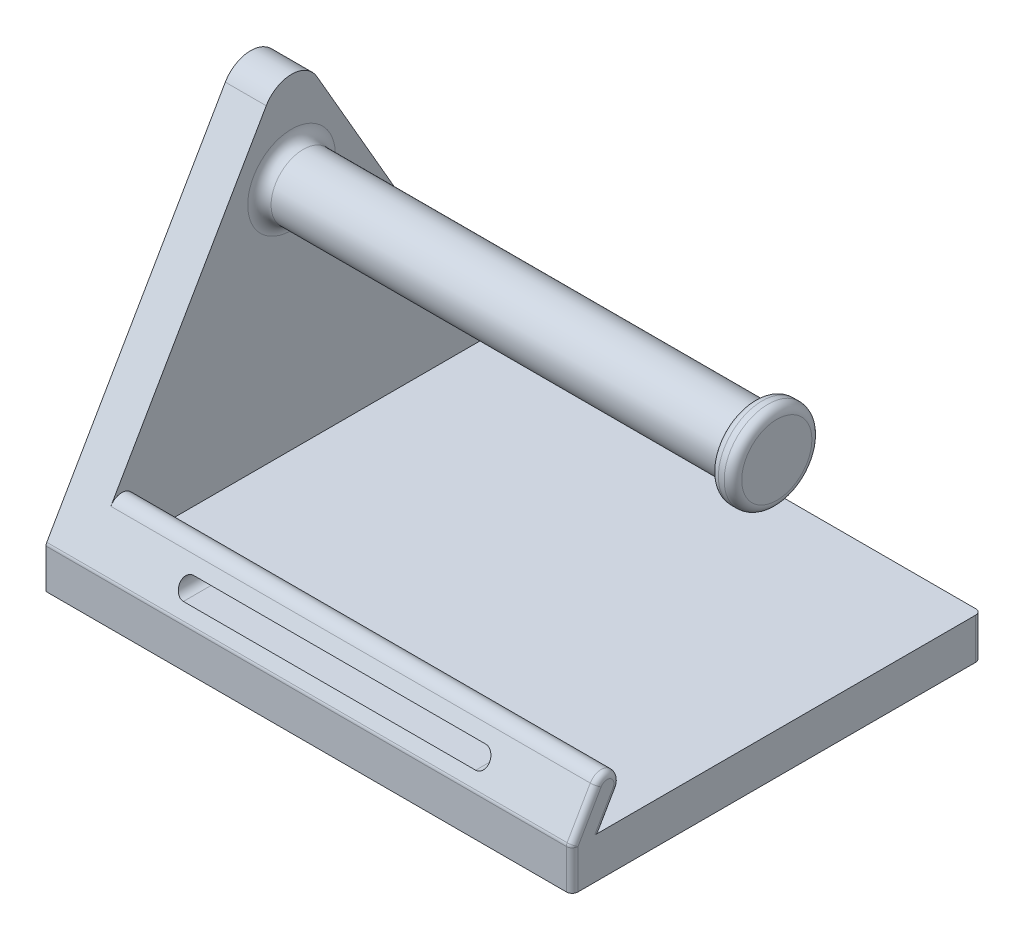
ISO-10303-21;
HEADER;
FILE_DESCRIPTION(('STEP AP214'),'2;1');
FILE_NAME('part.step','',(''),(''),'','','');
FILE_SCHEMA(('AUTOMOTIVE_DESIGN { 1 0 10303 214 1 1 1 1 }'));
ENDSEC;
DATA;
#1=APPLICATION_CONTEXT('core data for automotive mechanical design processes');
#2=APPLICATION_PROTOCOL_DEFINITION('international standard','automotive_design',2000,#1);
#3=PRODUCT_CONTEXT('',#1,'mechanical');
#4=PRODUCT('Part','Part','',(#3));
#5=PRODUCT_RELATED_PRODUCT_CATEGORY('part','',(#4));
#6=PRODUCT_DEFINITION_FORMATION('','',#4);
#7=PRODUCT_DEFINITION_CONTEXT('part definition',#1,'design');
#8=PRODUCT_DEFINITION('design','',#6,#7);
#9=PRODUCT_DEFINITION_SHAPE('','',#8);
#10=(LENGTH_UNIT() NAMED_UNIT(*) SI_UNIT(.MILLI.,.METRE.));
#11=(NAMED_UNIT(*) PLANE_ANGLE_UNIT() SI_UNIT($,.RADIAN.));
#12=(NAMED_UNIT(*) SI_UNIT($,.STERADIAN.) SOLID_ANGLE_UNIT());
#13=UNCERTAINTY_MEASURE_WITH_UNIT(LENGTH_MEASURE(1.E-05),#10,'distance_accuracy_value','');
#14=(GEOMETRIC_REPRESENTATION_CONTEXT(3) GLOBAL_UNCERTAINTY_ASSIGNED_CONTEXT((#13)) GLOBAL_UNIT_ASSIGNED_CONTEXT((#10,
#11,#12)) REPRESENTATION_CONTEXT('',''));
#15=CARTESIAN_POINT('',(0.,0.,0.));
#16=DIRECTION('',(0.,0.,1.));
#17=DIRECTION('',(1.,0.,0.));
#18=AXIS2_PLACEMENT_3D('',#15,#16,#17);
#19=CARTESIAN_POINT('',(87.5,40.,-35.));
#20=DIRECTION('',(1.,0.,0.));
#21=DIRECTION('',(0.,0.,-1.));
#22=AXIS2_PLACEMENT_3D('',#19,#20,#21);
#23=TOROIDAL_SURFACE('',#22,6.,1.5);
#24=CARTESIAN_POINT('',(86.,40.,-35.));
#25=DIRECTION('',(1.,0.,0.));
#26=DIRECTION('',(0.,0.,-1.));
#27=AXIS2_PLACEMENT_3D('',#24,#25,#26);
#28=CIRCLE('',#27,6.);
#29=CARTESIAN_POINT('',(86.,40.,-41.));
#30=VERTEX_POINT('',#29);
#31=EDGE_CURVE('E275',#30,#30,#28,.F.);
#32=ORIENTED_EDGE('',*,*,#31,.F.);
#33=EDGE_LOOP('',(#32));
#34=FACE_BOUND('',#33,.T.);
#35=CARTESIAN_POINT('',(87.5,40.,-35.));
#36=DIRECTION('',(1.,0.,0.));
#37=DIRECTION('',(0.,0.,-1.));
#38=AXIS2_PLACEMENT_3D('',#35,#36,#37);
#39=CIRCLE('',#38,7.5);
#40=CARTESIAN_POINT('',(87.5,40.,-42.5));
#41=VERTEX_POINT('',#40);
#42=EDGE_CURVE('E278',#41,#41,#39,.T.);
#43=ORIENTED_EDGE('',*,*,#42,.F.);
#44=EDGE_LOOP('',(#43));
#45=FACE_BOUND('',#44,.T.);
#46=ADVANCED_FACE('F69',(#34,#45),#23,.T.);
#47=CARTESIAN_POINT('',(88.5,40.,-35.));
#48=DIRECTION('',(1.,0.,0.));
#49=DIRECTION('',(0.,0.,-1.));
#50=AXIS2_PLACEMENT_3D('',#47,#48,#49);
#51=TOROIDAL_SURFACE('',#50,6.,1.5);
#52=CARTESIAN_POINT('',(88.5,40.,-35.));
#53=DIRECTION('',(1.,0.,0.));
#54=DIRECTION('',(0.,0.,-1.));
#55=AXIS2_PLACEMENT_3D('',#52,#53,#54);
#56=CIRCLE('',#55,7.5);
#57=CARTESIAN_POINT('',(88.5,40.,-42.5));
#58=VERTEX_POINT('',#57);
#59=EDGE_CURVE('E269',#58,#58,#56,.F.);
#60=ORIENTED_EDGE('',*,*,#59,.F.);
#61=EDGE_LOOP('',(#60));
#62=FACE_BOUND('',#61,.T.);
#63=CARTESIAN_POINT('',(90.,40.,-35.));
#64=DIRECTION('',(1.,0.,0.));
#65=DIRECTION('',(0.,0.,-1.));
#66=AXIS2_PLACEMENT_3D('',#63,#64,#65);
#67=CIRCLE('',#66,6.);
#68=CARTESIAN_POINT('',(90.,40.,-41.));
#69=VERTEX_POINT('',#68);
#70=EDGE_CURVE('E272',#69,#69,#67,.T.);
#71=ORIENTED_EDGE('',*,*,#70,.F.);
#72=EDGE_LOOP('',(#71));
#73=FACE_BOUND('',#72,.T.);
#74=ADVANCED_FACE('F341',(#62,#73),#51,.T.);
#75=CARTESIAN_POINT('',(101.521787523493,-0.267949192431126,-1.));
#76=DIRECTION('',(-1.,0.,0.));
#77=DIRECTION('',(0.,0.,1.));
#78=AXIS2_PLACEMENT_3D('',#75,#76,#77);
#79=CYLINDRICAL_SURFACE('',#78,1.);
#80=DIRECTION('',(1.,0.,0.));
#81=VECTOR('',#80,1.);
#82=CARTESIAN_POINT('',(101.521787523493,-0.267949192431126,0.));
#83=LINE('',#82,#81);
#84=CARTESIAN_POINT('',(89.,-0.267949192431126,0.));
#85=VERTEX_POINT('',#84);
#86=CARTESIAN_POINT('',(0.,-0.267949192431126,0.));
#87=VERTEX_POINT('',#86);
#88=EDGE_CURVE('E265',#85,#87,#83,.F.);
#89=ORIENTED_EDGE('',*,*,#88,.F.);
#90=CARTESIAN_POINT('',(89.,-0.267949192431126,-1.));
#91=DIRECTION('',(-1.,0.,0.));
#92=DIRECTION('',(0.,0.,1.));
#93=AXIS2_PLACEMENT_3D('',#90,#91,#92);
#94=CIRCLE('',#93,1.);
#95=CARTESIAN_POINT('',(89.,0.232050807568878,-0.133974596215563));
#96=VERTEX_POINT('',#95);
#97=EDGE_CURVE('E296',#85,#96,#94,.T.);
#98=ORIENTED_EDGE('',*,*,#97,.T.);
#99=DIRECTION('',(1.,0.,0.));
#100=VECTOR('',#99,1.);
#101=CARTESIAN_POINT('',(101.521787523493,0.232050807568878,-0.133974596215563));
#102=LINE('',#101,#100);
#103=CARTESIAN_POINT('',(0.,0.232050807568879,-0.133974596215564));
#104=VERTEX_POINT('',#103);
#105=EDGE_CURVE('E262',#104,#96,#102,.T.);
#106=ORIENTED_EDGE('',*,*,#105,.F.);
#107=CARTESIAN_POINT('',(0.,-0.267949192431126,-1.));
#108=DIRECTION('',(-1.,0.,0.));
#109=DIRECTION('',(0.,0.,1.));
#110=AXIS2_PLACEMENT_3D('',#107,#108,#109);
#111=CIRCLE('',#110,1.);
#112=EDGE_CURVE('E267',#87,#104,#111,.T.);
#113=ORIENTED_EDGE('',*,*,#112,.F.);
#114=EDGE_LOOP('',(#89,#98,#106,#113));
#115=FACE_BOUND('',#114,.T.);
#116=ADVANCED_FACE('F349',(#115),#79,.T.);
#117=CARTESIAN_POINT('',(90.,-0.267949192431125,-69.));
#118=DIRECTION('',(-1.,0.,0.));
#119=DIRECTION('',(0.,-1.,0.));
#120=AXIS2_PLACEMENT_3D('',#117,#118,#119);
#121=CYLINDRICAL_SURFACE('',#120,1.);
#122=DIRECTION('',(-1.,0.,0.));
#123=VECTOR('',#122,1.);
#124=CARTESIAN_POINT('',(90.,0.,-69.9634330440023));
#125=LINE('',#124,#123);
#126=CARTESIAN_POINT('',(89.2679491924311,0.,-69.9634330440023));
#127=VERTEX_POINT('',#126);
#128=CARTESIAN_POINT('',(7.00000000000001,0.,-69.9634330440023));
#129=VERTEX_POINT('',#128);
#130=EDGE_CURVE('E241',#127,#129,#125,.T.);
#131=ORIENTED_EDGE('',*,*,#130,.F.);
#132=CARTESIAN_POINT('',(89.,-0.267949192431125,-69.));
#133=DIRECTION('',(-0.707106781186547,0.707106781186548,0.));
#134=DIRECTION('',(-0.707106781186548,-0.707106781186547,0.));
#135=AXIS2_PLACEMENT_3D('',#132,#133,#134);
#136=ELLIPSE('',#135,1.41421356237309,1.);
#137=CARTESIAN_POINT('',(89.,-0.267949192431125,-70.));
#138=VERTEX_POINT('',#137);
#139=EDGE_CURVE('E92',#127,#138,#136,.T.);
#140=ORIENTED_EDGE('',*,*,#139,.T.);
#141=DIRECTION('',(1.,0.,0.));
#142=VECTOR('',#141,1.);
#143=CARTESIAN_POINT('',(90.,-0.267949192431125,-70.));
#144=LINE('',#143,#142);
#145=CARTESIAN_POINT('',(0.,-0.267949192431107,-70.));
#146=VERTEX_POINT('',#145);
#147=EDGE_CURVE('E238',#146,#138,#144,.T.);
#148=ORIENTED_EDGE('',*,*,#147,.F.);
#149=CARTESIAN_POINT('',(0.,-0.267949192431101,-69.));
#150=DIRECTION('',(-1.,0.,0.));
#151=DIRECTION('',(0.,0.,1.));
#152=AXIS2_PLACEMENT_3D('',#149,#150,#151);
#153=CIRCLE('',#152,1.);
#154=CARTESIAN_POINT('',(0.,0.23205080756887,-69.8660254037844));
#155=VERTEX_POINT('',#154);
#156=EDGE_CURVE('E260',#155,#146,#153,.T.);
#157=ORIENTED_EDGE('',*,*,#156,.F.);
#158=DIRECTION('',(1.,0.,0.));
#159=VECTOR('',#158,1.);
#160=CARTESIAN_POINT('',(90.,0.232050807568879,-69.8660254037844));
#161=LINE('',#160,#159);
#162=CARTESIAN_POINT('',(7.,0.23205080756887,-69.8660254037844));
#163=VERTEX_POINT('',#162);
#164=EDGE_CURVE('E257',#163,#155,#161,.F.);
#165=ORIENTED_EDGE('',*,*,#164,.F.);
#166=CARTESIAN_POINT('',(7.00000000000001,-0.267949192431103,-69.));
#167=DIRECTION('',(1.,0.,0.));
#168=DIRECTION('',(0.,0.,-1.));
#169=AXIS2_PLACEMENT_3D('',#166,#167,#168);
#170=CIRCLE('',#169,1.);
#171=EDGE_CURVE('E254',#129,#163,#170,.T.);
#172=ORIENTED_EDGE('',*,*,#171,.F.);
#173=EDGE_LOOP('',(#131,#140,#148,#157,#165,#172));
#174=FACE_BOUND('',#173,.T.);
#175=ADVANCED_FACE('F524',(#174),#121,.T.);
#176=CARTESIAN_POINT('',(0.,0.,0.));
#177=DIRECTION('',(0.,1.,0.));
#178=DIRECTION('',(0.,0.,1.));
#179=AXIS2_PLACEMENT_3D('',#176,#177,#178);
#180=PLANE('',#179);
#181=DIRECTION('',(0.,0.,-1.));
#182=VECTOR('',#181,1.);
#183=CARTESIAN_POINT('',(90.,0.,0.));
#184=LINE('',#183,#182);
#185=CARTESIAN_POINT('',(90.,0.,-3.84529946162075));
#186=VERTEX_POINT('',#185);
#187=CARTESIAN_POINT('',(90.,0.,-69.));
#188=VERTEX_POINT('',#187);
#189=EDGE_CURVE('E423',#186,#188,#184,.T.);
#190=ORIENTED_EDGE('',*,*,#189,.T.);
#191=CARTESIAN_POINT('',(89.,0.,-69.));
#192=DIRECTION('',(0.,1.,0.));
#193=DIRECTION('',(0.,0.,1.));
#194=AXIS2_PLACEMENT_3D('',#191,#192,#193);
#195=CIRCLE('',#194,1.);
#196=EDGE_CURVE('E319',#188,#127,#195,.T.);
#197=ORIENTED_EDGE('',*,*,#196,.T.);
#198=ORIENTED_EDGE('',*,*,#130,.T.);
#199=DIRECTION('',(0.,0.,-1.));
#200=VECTOR('',#199,1.);
#201=CARTESIAN_POINT('',(7.,0.,0.));
#202=LINE('',#201,#200);
#203=CARTESIAN_POINT('',(7.,0.,-5.));
#204=VERTEX_POINT('',#203);
#205=EDGE_CURVE('E511',#204,#129,#202,.T.);
#206=ORIENTED_EDGE('',*,*,#205,.F.);
#207=DIRECTION('',(-1.,0.,0.));
#208=VECTOR('',#207,1.);
#209=CARTESIAN_POINT('',(101.521787523493,0.,-5.));
#210=LINE('',#209,#208);
#211=CARTESIAN_POINT('',(89.,0.,-5.));
#212=VERTEX_POINT('',#211);
#213=EDGE_CURVE('E419',#212,#204,#210,.T.);
#214=ORIENTED_EDGE('',*,*,#213,.F.);
#215=CARTESIAN_POINT('',(89.,0.,-3.84529946162075));
#216=DIRECTION('',(0.,1.,0.));
#217=DIRECTION('',(0.,0.,1.));
#218=AXIS2_PLACEMENT_3D('',#215,#216,#217);
#219=ELLIPSE('',#218,1.15470053837925,1.);
#220=EDGE_CURVE('E302',#212,#186,#219,.F.);
#221=ORIENTED_EDGE('',*,*,#220,.T.);
#222=EDGE_LOOP('',(#190,#197,#198,#206,#214,#221));
#223=FACE_BOUND('',#222,.T.);
#224=ADVANCED_FACE('F529',(#223),#180,.T.);
#225=CARTESIAN_POINT('',(90.,-7.,-70.));
#226=DIRECTION('',(0.,0.,-1.));
#227=DIRECTION('',(-1.,0.,0.));
#228=AXIS2_PLACEMENT_3D('',#225,#226,#227);
#229=PLANE('',#228);
#230=ORIENTED_EDGE('',*,*,#147,.T.);
#231=DIRECTION('',(0.,1.,0.));
#232=VECTOR('',#231,1.);
#233=CARTESIAN_POINT('',(89.,-7.,-70.));
#234=LINE('',#233,#232);
#235=CARTESIAN_POINT('',(89.,-7.,-70.));
#236=VERTEX_POINT('',#235);
#237=EDGE_CURVE('E84',#138,#236,#234,.F.);
#238=ORIENTED_EDGE('',*,*,#237,.T.);
#239=DIRECTION('',(-1.,0.,0.));
#240=VECTOR('',#239,1.);
#241=CARTESIAN_POINT('',(90.,-7.,-70.));
#242=LINE('',#241,#240);
#243=CARTESIAN_POINT('',(0.,-7.,-70.));
#244=VERTEX_POINT('',#243);
#245=EDGE_CURVE('E433',#236,#244,#242,.T.);
#246=ORIENTED_EDGE('',*,*,#245,.T.);
#247=DIRECTION('',(0.,1.,0.));
#248=VECTOR('',#247,1.);
#249=CARTESIAN_POINT('',(0.,-7.,-70.));
#250=LINE('',#249,#248);
#251=EDGE_CURVE('E444',#244,#146,#250,.T.);
#252=ORIENTED_EDGE('',*,*,#251,.T.);
#253=EDGE_LOOP('',(#230,#238,#246,#252));
#254=FACE_BOUND('',#253,.T.);
#255=ADVANCED_FACE('F732',(#254),#229,.T.);
#256=CARTESIAN_POINT('',(90.,-7.,0.));
#257=DIRECTION('',(1.,0.,0.));
#258=DIRECTION('',(0.,0.,-1.));
#259=AXIS2_PLACEMENT_3D('',#256,#257,#258);
#260=PLANE('',#259);
#261=DIRECTION('',(0.,0.,-1.));
#262=VECTOR('',#261,1.);
#263=CARTESIAN_POINT('',(90.,-7.,0.));
#264=LINE('',#263,#262);
#265=CARTESIAN_POINT('',(90.,-7.,-1.));
#266=VERTEX_POINT('',#265);
#267=CARTESIAN_POINT('',(90.,-7.,-69.));
#268=VERTEX_POINT('',#267);
#269=EDGE_CURVE('E441',#266,#268,#264,.T.);
#270=ORIENTED_EDGE('',*,*,#269,.T.);
#271=DIRECTION('',(0.,1.,0.));
#272=VECTOR('',#271,1.);
#273=CARTESIAN_POINT('',(90.,-7.,-69.));
#274=LINE('',#273,#272);
#275=EDGE_CURVE('E305',#268,#188,#274,.T.);
#276=ORIENTED_EDGE('',*,*,#275,.T.);
#277=ORIENTED_EDGE('',*,*,#189,.F.);
#278=DIRECTION('',(0.,0.866025403784439,-0.5));
#279=VECTOR('',#278,1.);
#280=CARTESIAN_POINT('',(90.,5.41746824526945,-6.97307621135332));
#281=LINE('',#280,#279);
#282=CARTESIAN_POINT('',(90.,5.41746824526945,-6.97307621135332));
#283=VERTEX_POINT('',#282);
#284=EDGE_CURVE('E287',#186,#283,#281,.T.);
#285=ORIENTED_EDGE('',*,*,#284,.T.);
#286=CARTESIAN_POINT('',(90.,6.,-5.96410161513775));
#287=DIRECTION('',(1.,0.,0.));
#288=DIRECTION('',(0.,0.,-1.));
#289=AXIS2_PLACEMENT_3D('',#286,#287,#288);
#290=CIRCLE('',#289,1.1650635094611);
#291=CARTESIAN_POINT('',(90.,6.58253175473053,-4.95512701892223));
#292=VERTEX_POINT('',#291);
#293=EDGE_CURVE('E285',#283,#292,#290,.T.);
#294=ORIENTED_EDGE('',*,*,#293,.T.);
#295=DIRECTION('',(0.,-0.866025403784436,0.500000000000004));
#296=VECTOR('',#295,1.);
#297=CARTESIAN_POINT('',(90.,-0.267949192431126,-1.));
#298=LINE('',#297,#296);
#299=CARTESIAN_POINT('',(90.,-0.267949192431126,-1.));
#300=VERTEX_POINT('',#299);
#301=EDGE_CURVE('E283',#292,#300,#298,.T.);
#302=ORIENTED_EDGE('',*,*,#301,.T.);
#303=DIRECTION('',(0.,1.,0.));
#304=VECTOR('',#303,1.);
#305=CARTESIAN_POINT('',(90.,-7.,-1.));
#306=LINE('',#305,#304);
#307=EDGE_CURVE('E281',#300,#266,#306,.F.);
#308=ORIENTED_EDGE('',*,*,#307,.T.);
#309=EDGE_LOOP('',(#270,#276,#277,#285,#294,#302,#308));
#310=FACE_BOUND('',#309,.T.);
#311=ADVANCED_FACE('F536',(#310),#260,.T.);
#312=CARTESIAN_POINT('',(0.,-7.,0.));
#313=DIRECTION('',(0.,0.,1.));
#314=DIRECTION('',(1.,0.,0.));
#315=AXIS2_PLACEMENT_3D('',#312,#313,#314);
#316=PLANE('',#315);
#317=DIRECTION('',(1.,0.,0.));
#318=VECTOR('',#317,1.);
#319=CARTESIAN_POINT('',(0.,-7.,0.));
#320=LINE('',#319,#318);
#321=CARTESIAN_POINT('',(0.,-7.,0.));
#322=VERTEX_POINT('',#321);
#323=CARTESIAN_POINT('',(89.,-7.,0.));
#324=VERTEX_POINT('',#323);
#325=EDGE_CURVE('E438',#322,#324,#320,.T.);
#326=ORIENTED_EDGE('',*,*,#325,.T.);
#327=DIRECTION('',(0.,1.,0.));
#328=VECTOR('',#327,1.);
#329=CARTESIAN_POINT('',(89.,-7.,0.));
#330=LINE('',#329,#328);
#331=EDGE_CURVE('E298',#324,#85,#330,.T.);
#332=ORIENTED_EDGE('',*,*,#331,.T.);
#333=ORIENTED_EDGE('',*,*,#88,.T.);
#334=DIRECTION('',(0.,1.,0.));
#335=VECTOR('',#334,1.);
#336=CARTESIAN_POINT('',(0.,-7.,0.));
#337=LINE('',#336,#335);
#338=EDGE_CURVE('E447',#322,#87,#337,.T.);
#339=ORIENTED_EDGE('',*,*,#338,.F.);
#340=EDGE_LOOP('',(#326,#332,#333,#339));
#341=FACE_BOUND('',#340,.T.);
#342=ADVANCED_FACE('F581',(#341),#316,.T.);
#343=CARTESIAN_POINT('',(0.,-7.,-70.));
#344=DIRECTION('',(-1.,0.,0.));
#345=DIRECTION('',(0.,0.,1.));
#346=AXIS2_PLACEMENT_3D('',#343,#344,#345);
#347=PLANE('',#346);
#348=ORIENTED_EDGE('',*,*,#338,.T.);
#349=ORIENTED_EDGE('',*,*,#112,.T.);
#350=DIRECTION('',(0.,0.866025403784436,-0.500000000000004));
#351=VECTOR('',#350,1.);
#352=CARTESIAN_POINT('',(0.,0.,0.));
#353=LINE('',#352,#351);
#354=CARTESIAN_POINT('',(0.,53.1217782649101,-30.6698729810778));
#355=VERTEX_POINT('',#354);
#356=EDGE_CURVE('E396',#104,#355,#353,.T.);
#357=ORIENTED_EDGE('',*,*,#356,.T.);
#358=CARTESIAN_POINT('',(0.,50.6217782649101,-35.));
#359=DIRECTION('',(1.,0.,0.));
#360=DIRECTION('',(0.,0.,-1.));
#361=AXIS2_PLACEMENT_3D('',#358,#359,#360);
#362=CIRCLE('',#361,4.99999999999999);
#363=CARTESIAN_POINT('',(0.,53.1217782649101,-39.3301270189222));
#364=VERTEX_POINT('',#363);
#365=EDGE_CURVE('E405',#364,#355,#362,.T.);
#366=ORIENTED_EDGE('',*,*,#365,.F.);
#367=DIRECTION('',(0.,0.866025403784436,0.500000000000004));
#368=VECTOR('',#367,1.);
#369=CARTESIAN_POINT('',(0.,30.3108891324555,-52.4999999999997));
#370=LINE('',#369,#368);
#371=EDGE_CURVE('E402',#155,#364,#370,.T.);
#372=ORIENTED_EDGE('',*,*,#371,.F.);
#373=ORIENTED_EDGE('',*,*,#156,.T.);
#374=ORIENTED_EDGE('',*,*,#251,.F.);
#375=DIRECTION('',(0.,0.,1.));
#376=VECTOR('',#375,1.);
#377=CARTESIAN_POINT('',(0.,-7.,-70.));
#378=LINE('',#377,#376);
#379=EDGE_CURVE('E435',#244,#322,#378,.T.);
#380=ORIENTED_EDGE('',*,*,#379,.T.);
#381=EDGE_LOOP('',(#348,#349,#357,#366,#372,#373,#374,#380));
#382=FACE_BOUND('',#381,.T.);
#383=ADVANCED_FACE('F499',(#382),#347,.T.);
#384=CARTESIAN_POINT('',(0.,-7.,0.));
#385=DIRECTION('',(0.,1.,0.));
#386=DIRECTION('',(0.,0.,1.));
#387=AXIS2_PLACEMENT_3D('',#384,#385,#386);
#388=PLANE('',#387);
#389=ORIENTED_EDGE('',*,*,#245,.F.);
#390=CARTESIAN_POINT('',(89.,-7.,-69.));
#391=DIRECTION('',(0.,1.,0.));
#392=DIRECTION('',(0.,0.,1.));
#393=AXIS2_PLACEMENT_3D('',#390,#391,#392);
#394=CIRCLE('',#393,1.);
#395=EDGE_CURVE('E323',#236,#268,#394,.F.);
#396=ORIENTED_EDGE('',*,*,#395,.T.);
#397=ORIENTED_EDGE('',*,*,#269,.F.);
#398=CARTESIAN_POINT('',(89.,-7.,-1.));
#399=DIRECTION('',(0.,1.,0.));
#400=DIRECTION('',(0.,0.,1.));
#401=AXIS2_PLACEMENT_3D('',#398,#399,#400);
#402=CIRCLE('',#401,1.);
#403=EDGE_CURVE('E300',#266,#324,#402,.F.);
#404=ORIENTED_EDGE('',*,*,#403,.T.);
#405=ORIENTED_EDGE('',*,*,#325,.F.);
#406=ORIENTED_EDGE('',*,*,#379,.F.);
#407=EDGE_LOOP('',(#389,#396,#397,#404,#405,#406));
#408=FACE_BOUND('',#407,.T.);
#409=ADVANCED_FACE('F492',(#408),#388,.F.);
#410=CARTESIAN_POINT('',(101.521787523493,0.,0.));
#411=DIRECTION('',(0.,-0.500000000000004,-0.866025403784436));
#412=DIRECTION('',(0.,0.866025403784436,-0.500000000000004));
#413=AXIS2_PLACEMENT_3D('',#410,#411,#412);
#414=PLANE('',#413);
#415=DIRECTION('',(-1.,0.,0.));
#416=VECTOR('',#415,1.);
#417=CARTESIAN_POINT('',(101.521787523493,2.07843051838471,-1.19998241928136));
#418=LINE('',#417,#416);
#419=CARTESIAN_POINT('',(72.2972302476615,2.07843051838471,-1.19998241928136));
#420=VERTEX_POINT('',#419);
#421=CARTESIAN_POINT('',(22.2972302476615,2.07843051838471,-1.19998241928136));
#422=VERTEX_POINT('',#421);
#423=EDGE_CURVE('E230',#420,#422,#418,.T.);
#424=ORIENTED_EDGE('',*,*,#423,.T.);
#425=CARTESIAN_POINT('',(22.2972302476615,3.57843051838471,-2.06600782306581));
#426=DIRECTION('',(0.,-0.500000000000004,-0.866025403784436));
#427=DIRECTION('',(0.,-0.866025403784436,0.500000000000004));
#428=AXIS2_PLACEMENT_3D('',#425,#426,#427);
#429=ELLIPSE('',#428,1.73205080756888,1.5);
#430=CARTESIAN_POINT('',(22.2972302476615,5.07843051838471,-2.93203322685026));
#431=VERTEX_POINT('',#430);
#432=EDGE_CURVE('E505',#422,#431,#429,.T.);
#433=ORIENTED_EDGE('',*,*,#432,.T.);
#434=DIRECTION('',(1.,0.,0.));
#435=VECTOR('',#434,1.);
#436=CARTESIAN_POINT('',(101.521787523493,5.07843051838471,-2.93203322685026));
#437=LINE('',#436,#435);
#438=CARTESIAN_POINT('',(72.2972302476615,5.07843051838471,-2.93203322685026));
#439=VERTEX_POINT('',#438);
#440=EDGE_CURVE('E552',#431,#439,#437,.T.);
#441=ORIENTED_EDGE('',*,*,#440,.T.);
#442=CARTESIAN_POINT('',(72.2972302476615,3.57843051838471,-2.06600782306581));
#443=DIRECTION('',(0.,-0.500000000000004,-0.866025403784436));
#444=DIRECTION('',(0.,-0.866025403784436,0.500000000000004));
#445=AXIS2_PLACEMENT_3D('',#442,#443,#444);
#446=ELLIPSE('',#445,1.73205080756888,1.5);
#447=EDGE_CURVE('E222',#439,#420,#446,.T.);
#448=ORIENTED_EDGE('',*,*,#447,.T.);
#449=EDGE_LOOP('',(#424,#433,#441,#448));
#450=FACE_BOUND('',#449,.T.);
#451=ORIENTED_EDGE('',*,*,#105,.T.);
#452=DIRECTION('',(0.,-0.866025403784436,0.500000000000004));
#453=VECTOR('',#452,1.);
#454=CARTESIAN_POINT('',(89.,7.08253175473053,-4.08910161513779));
#455=LINE('',#454,#453);
#456=CARTESIAN_POINT('',(89.,7.08253175473053,-4.08910161513779));
#457=VERTEX_POINT('',#456);
#458=EDGE_CURVE('E294',#96,#457,#455,.F.);
#459=ORIENTED_EDGE('',*,*,#458,.T.);
#460=DIRECTION('',(-1.,0.,0.));
#461=VECTOR('',#460,1.);
#462=CARTESIAN_POINT('',(101.521787523493,7.08253175473053,-4.08910161513779));
#463=LINE('',#462,#461);
#464=CARTESIAN_POINT('',(7.,7.08253175473054,-4.08910161513779));
#465=VERTEX_POINT('',#464);
#466=EDGE_CURVE('E424',#457,#465,#463,.T.);
#467=ORIENTED_EDGE('',*,*,#466,.T.);
#468=DIRECTION('',(0.,0.866025403784436,-0.500000000000004));
#469=VECTOR('',#468,1.);
#470=CARTESIAN_POINT('',(7.,0.,0.));
#471=LINE('',#470,#469);
#472=CARTESIAN_POINT('',(7.,53.1217782649101,-30.6698729810778));
#473=VERTEX_POINT('',#472);
#474=EDGE_CURVE('E414',#465,#473,#471,.T.);
#475=ORIENTED_EDGE('',*,*,#474,.T.);
#476=DIRECTION('',(-1.,0.,0.));
#477=VECTOR('',#476,1.);
#478=CARTESIAN_POINT('',(7.,53.1217782649101,-30.6698729810778));
#479=LINE('',#478,#477);
#480=EDGE_CURVE('E398',#473,#355,#479,.T.);
#481=ORIENTED_EDGE('',*,*,#480,.T.);
#482=ORIENTED_EDGE('',*,*,#356,.F.);
#483=EDGE_LOOP('',(#451,#459,#467,#475,#481,#482));
#484=FACE_BOUND('',#483,.T.);
#485=ADVANCED_FACE('F393',(#450,#484),#414,.F.);
#486=CARTESIAN_POINT('',(101.521787523493,-2.1650635094611,-3.75));
#487=DIRECTION('',(0.,0.5,0.866025403784439));
#488=DIRECTION('',(0.,-0.866025403784439,0.5));
#489=AXIS2_PLACEMENT_3D('',#486,#487,#488);
#490=PLANE('',#489);
#491=DIRECTION('',(-1.,0.,0.));
#492=VECTOR('',#491,1.);
#493=CARTESIAN_POINT('',(101.521787523493,4.91746824526945,-7.83910161513775));
#494=LINE('',#493,#492);
#495=CARTESIAN_POINT('',(89.,4.91746824526945,-7.83910161513775));
#496=VERTEX_POINT('',#495);
#497=CARTESIAN_POINT('',(72.9732317017866,4.91746824526945,-7.83910161513775));
#498=VERTEX_POINT('',#497);
#499=EDGE_CURVE('E429',#496,#498,#494,.T.);
#500=ORIENTED_EDGE('',*,*,#499,.F.);
#501=DIRECTION('',(0.,0.866025403784439,-0.5));
#502=VECTOR('',#501,1.);
#503=CARTESIAN_POINT('',(89.,0.,-5.));
#504=LINE('',#503,#502);
#505=EDGE_CURVE('E290',#496,#212,#504,.F.);
#506=ORIENTED_EDGE('',*,*,#505,.T.);
#507=ORIENTED_EDGE('',*,*,#213,.T.);
#508=DIRECTION('',(0.,0.866025403784439,-0.5));
#509=VECTOR('',#508,1.);
#510=CARTESIAN_POINT('',(7.,-2.1650635094611,-3.75));
#511=LINE('',#510,#509);
#512=CARTESIAN_POINT('',(7.00000000000001,4.91746824526945,-7.83910161513775));
#513=VERTEX_POINT('',#512);
#514=EDGE_CURVE('E425',#204,#513,#511,.T.);
#515=ORIENTED_EDGE('',*,*,#514,.T.);
#516=CARTESIAN_POINT('',(21.6212287935363,4.91746824526945,-7.83910161513775));
#517=VERTEX_POINT('',#516);
#518=EDGE_CURVE('E428',#517,#513,#494,.T.);
#519=ORIENTED_EDGE('',*,*,#518,.F.);
#520=CARTESIAN_POINT('',(22.2972302476615,3.57843051838471,-7.06600782306579));
#521=DIRECTION('',(0.,0.5,0.866025403784439));
#522=DIRECTION('',(0.,-0.866025403784439,0.5));
#523=AXIS2_PLACEMENT_3D('',#520,#521,#522);
#524=ELLIPSE('',#523,1.73205080756888,1.5);
#525=CARTESIAN_POINT('',(22.2972302476615,2.07843051838471,-6.19998241928135));
#526=VERTEX_POINT('',#525);
#527=EDGE_CURVE('E237',#517,#526,#524,.T.);
#528=ORIENTED_EDGE('',*,*,#527,.T.);
#529=DIRECTION('',(1.,0.,0.));
#530=VECTOR('',#529,1.);
#531=CARTESIAN_POINT('',(101.521787523493,2.07843051838471,-6.19998241928135));
#532=LINE('',#531,#530);
#533=CARTESIAN_POINT('',(72.2972302476615,2.07843051838471,-6.19998241928135));
#534=VERTEX_POINT('',#533);
#535=EDGE_CURVE('E227',#526,#534,#532,.T.);
#536=ORIENTED_EDGE('',*,*,#535,.T.);
#537=CARTESIAN_POINT('',(72.2972302476615,3.57843051838471,-7.06600782306579));
#538=DIRECTION('',(0.,0.5,0.866025403784439));
#539=DIRECTION('',(0.,-0.866025403784439,0.5));
#540=AXIS2_PLACEMENT_3D('',#537,#538,#539);
#541=ELLIPSE('',#540,1.73205080756888,1.5);
#542=EDGE_CURVE('E212',#534,#498,#541,.T.);
#543=ORIENTED_EDGE('',*,*,#542,.T.);
#544=EDGE_LOOP('',(#500,#506,#507,#515,#519,#528,#536,#543));
#545=FACE_BOUND('',#544,.T.);
#546=ADVANCED_FACE('F235',(#545),#490,.F.);
#547=CARTESIAN_POINT('',(101.521787523493,6.,-5.96410161513775));
#548=DIRECTION('',(-1.,0.,0.));
#549=DIRECTION('',(0.,0.,1.));
#550=AXIS2_PLACEMENT_3D('',#547,#548,#549);
#551=CYLINDRICAL_SURFACE('',#550,2.1650635094611);
#552=ORIENTED_EDGE('',*,*,#466,.F.);
#553=CARTESIAN_POINT('',(89.,6.,-5.96410161513775));
#554=DIRECTION('',(1.,0.,0.));
#555=DIRECTION('',(0.,0.,-1.));
#556=AXIS2_PLACEMENT_3D('',#553,#554,#555);
#557=CIRCLE('',#556,2.1650635094611);
#558=EDGE_CURVE('E292',#457,#496,#557,.F.);
#559=ORIENTED_EDGE('',*,*,#558,.T.);
#560=ORIENTED_EDGE('',*,*,#499,.T.);
#561=CARTESIAN_POINT('',(72.2972302476615,5.07843051838471,-7.92323654937667));
#562=CARTESIAN_POINT('',(72.3353503957605,5.07843037902525,-7.92323008057499));
#563=CARTESIAN_POINT('',(72.3734478207841,5.07697577952006,-7.92255296547002));
#564=CARTESIAN_POINT('',(72.4493867380198,5.0711801757175,-7.91981347568703));
#565=CARTESIAN_POINT('',(72.4872281272558,5.06683807256434,-7.91775057363693));
#566=CARTESIAN_POINT('',(72.5982909560116,5.04977979863908,-7.90954484181744));
#567=CARTESIAN_POINT('',(72.6708134948777,5.0330265576434,-7.9013871967653));
#568=CARTESIAN_POINT('',(72.7812301115035,4.99882103073491,-7.88382243777807));
#569=CARTESIAN_POINT('',(72.8205679305697,4.98478716039565,-7.87647196753051));
#570=CARTESIAN_POINT('',(72.8980384092417,4.95349373815248,-7.8595277744137));
#571=CARTESIAN_POINT('',(72.9361495595117,4.93619566739387,-7.84990687950776));
#572=CARTESIAN_POINT('',(72.9732317017866,4.91746824526945,-7.83910161513775));
#573=B_SPLINE_CURVE_WITH_KNOTS('',3,(#561,#562,#563,#564,#565,#566,#567,#568,#569,#570,#571,
#572),.UNSPECIFIED.,.F.,.F.,(4,2,2,2,2,4),(0.,0.114281155895964,0.228605827037144,
0.452031664459929,0.57908678894972,0.707747377984426),.UNSPECIFIED.);
#574=CARTESIAN_POINT('',(72.2972302476615,5.07843051838471,-7.92323654937667));
#575=VERTEX_POINT('',#574);
#576=EDGE_CURVE('E218',#575,#498,#573,.T.);
#577=ORIENTED_EDGE('',*,*,#576,.F.);
#578=DIRECTION('',(-1.,0.,0.));
#579=VECTOR('',#578,1.);
#580=CARTESIAN_POINT('',(101.521787523493,5.07843051838471,-7.92323654937667));
#581=LINE('',#580,#579);
#582=CARTESIAN_POINT('',(22.2972302476615,5.07843051838471,-7.92323654937667));
#583=VERTEX_POINT('',#582);
#584=EDGE_CURVE('E243',#583,#575,#581,.F.);
#585=ORIENTED_EDGE('',*,*,#584,.F.);
#586=CARTESIAN_POINT('',(21.6212287935363,4.91746824526945,-7.83910161513775));
#587=CARTESIAN_POINT('',(21.6541465261248,4.93409590201454,-7.84869597085399));
#588=CARTESIAN_POINT('',(21.6878976566739,4.94960218920785,-7.85735906456177));
#589=CARTESIAN_POINT('',(21.7568048061542,4.97818946118593,-7.87294260768691));
#590=CARTESIAN_POINT('',(21.7919609568429,4.99127021786168,-7.87986289322378));
#591=CARTESIAN_POINT('',(21.8626386618076,5.01456644416369,-7.8919470690561));
#592=CARTESIAN_POINT('',(21.8981359398919,5.02483767785636,-7.89714565407582));
#593=CARTESIAN_POINT('',(21.9699514815955,5.04275903183804,-7.90608241805041));
#594=CARTESIAN_POINT('',(22.0062694597967,5.05041004885955,-7.90982109669933));
#595=CARTESIAN_POINT('',(22.0845025300791,5.06386932633949,-7.91633796037418));
#596=CARTESIAN_POINT('',(22.1265030816309,5.0692818050847,-7.91891452653293));
#597=CARTESIAN_POINT('',(22.211410297811,5.07658977949549,-7.9223702872635));
#598=CARTESIAN_POINT('',(22.2543217204572,5.07844032141437,-7.92322779179147));
#599=CARTESIAN_POINT('',(22.2972302476615,5.07843051838471,-7.92323654937667));
#600=B_SPLINE_CURVE_WITH_KNOTS('',3,(#586,#587,#588,#589,#590,#591,#592,#593,#594,#595,#596,
#597,#598,#599),.UNSPECIFIED.,.F.,.F.,(4,2,2,2,2,2,4),(0.,0.114277822039546,0.228566385892137,
0.340387468233156,0.45217024304061,0.579259371538214,0.707942185806083),.UNSPECIFIED.);
#601=EDGE_CURVE('E239',#517,#583,#600,.T.);
#602=ORIENTED_EDGE('',*,*,#601,.F.);
#603=ORIENTED_EDGE('',*,*,#518,.T.);
#604=CARTESIAN_POINT('',(7.,6.,-5.96410161513775));
#605=DIRECTION('',(1.,0.,0.));
#606=DIRECTION('',(0.,0.,-1.));
#607=AXIS2_PLACEMENT_3D('',#604,#605,#606);
#608=CIRCLE('',#607,2.1650635094611);
#609=EDGE_CURVE('E420',#465,#513,#608,.F.);
#610=ORIENTED_EDGE('',*,*,#609,.F.);
#611=EDGE_LOOP('',(#552,#559,#560,#577,#585,#602,#603,#610));
#612=FACE_BOUND('',#611,.T.);
#613=ADVANCED_FACE('F456',(#612),#551,.T.);
#614=CARTESIAN_POINT('',(7.,0.,0.));
#615=DIRECTION('',(1.,0.,0.));
#616=DIRECTION('',(0.,0.,-1.));
#617=AXIS2_PLACEMENT_3D('',#614,#615,#616);
#618=PLANE('',#617);
#619=CARTESIAN_POINT('',(7.,40.,-35.));
#620=DIRECTION('',(1.,0.,0.));
#621=DIRECTION('',(0.,0.,-1.));
#622=AXIS2_PLACEMENT_3D('',#619,#620,#621);
#623=CIRCLE('',#622,7.5);
#624=CARTESIAN_POINT('',(7.,40.,-42.5));
#625=VERTEX_POINT('',#624);
#626=EDGE_CURVE('E12',#625,#625,#623,.F.);
#627=ORIENTED_EDGE('',*,*,#626,.T.);
#628=EDGE_LOOP('',(#627));
#629=FACE_BOUND('',#628,.T.);
#630=ORIENTED_EDGE('',*,*,#205,.T.);
#631=ORIENTED_EDGE('',*,*,#171,.T.);
#632=DIRECTION('',(0.,0.866025403784436,0.500000000000004));
#633=VECTOR('',#632,1.);
#634=CARTESIAN_POINT('',(7.,30.3108891324555,-52.4999999999997));
#635=LINE('',#634,#633);
#636=CARTESIAN_POINT('',(7.,53.1217782649101,-39.3301270189222));
#637=VERTEX_POINT('',#636);
#638=EDGE_CURVE('E513',#163,#637,#635,.T.);
#639=ORIENTED_EDGE('',*,*,#638,.T.);
#640=CARTESIAN_POINT('',(7.,50.6217782649101,-35.));
#641=DIRECTION('',(1.,0.,0.));
#642=DIRECTION('',(0.,0.,-1.));
#643=AXIS2_PLACEMENT_3D('',#640,#641,#642);
#644=CIRCLE('',#643,4.99999999999999);
#645=EDGE_CURVE('E410',#637,#473,#644,.T.);
#646=ORIENTED_EDGE('',*,*,#645,.T.);
#647=ORIENTED_EDGE('',*,*,#474,.F.);
#648=ORIENTED_EDGE('',*,*,#609,.T.);
#649=ORIENTED_EDGE('',*,*,#514,.F.);
#650=EDGE_LOOP('',(#630,#631,#639,#646,#647,#648,#649));
#651=FACE_BOUND('',#650,.T.);
#652=ADVANCED_FACE('F481',(#629,#651),#618,.T.);
#653=CARTESIAN_POINT('',(7.,30.3108891324555,-52.4999999999997));
#654=DIRECTION('',(0.,-0.500000000000004,0.866025403784436));
#655=DIRECTION('',(0.,-0.866025403784436,-0.500000000000004));
#656=AXIS2_PLACEMENT_3D('',#653,#654,#655);
#657=PLANE('',#656);
#658=ORIENTED_EDGE('',*,*,#638,.F.);
#659=ORIENTED_EDGE('',*,*,#164,.T.);
#660=ORIENTED_EDGE('',*,*,#371,.T.);
#661=DIRECTION('',(-1.,0.,0.));
#662=VECTOR('',#661,1.);
#663=CARTESIAN_POINT('',(7.,53.1217782649101,-39.3301270189222));
#664=LINE('',#663,#662);
#665=EDGE_CURVE('E416',#637,#364,#664,.T.);
#666=ORIENTED_EDGE('',*,*,#665,.F.);
#667=EDGE_LOOP('',(#658,#659,#660,#666));
#668=FACE_BOUND('',#667,.T.);
#669=ADVANCED_FACE('F484',(#668),#657,.F.);
#670=CARTESIAN_POINT('',(7.,50.6217782649101,-35.));
#671=DIRECTION('',(-1.,0.,0.));
#672=DIRECTION('',(0.,0.,1.));
#673=AXIS2_PLACEMENT_3D('',#670,#671,#672);
#674=CYLINDRICAL_SURFACE('',#673,4.99999999999999);
#675=ORIENTED_EDGE('',*,*,#365,.T.);
#676=ORIENTED_EDGE('',*,*,#480,.F.);
#677=ORIENTED_EDGE('',*,*,#645,.F.);
#678=ORIENTED_EDGE('',*,*,#665,.T.);
#679=EDGE_LOOP('',(#675,#676,#677,#678));
#680=FACE_BOUND('',#679,.T.);
#681=ADVANCED_FACE('F480',(#680),#674,.T.);
#682=CARTESIAN_POINT('',(86.,40.,-35.));
#683=DIRECTION('',(-1.,0.,0.));
#684=DIRECTION('',(0.,0.,1.));
#685=AXIS2_PLACEMENT_3D('',#682,#683,#684);
#686=CYLINDRICAL_SURFACE('',#685,5.5);
#687=CARTESIAN_POINT('',(8.99999999999999,40.,-35.));
#688=DIRECTION('',(1.,0.,0.));
#689=DIRECTION('',(0.,0.,-1.));
#690=AXIS2_PLACEMENT_3D('',#687,#688,#689);
#691=CIRCLE('',#690,5.5);
#692=CARTESIAN_POINT('',(8.99999999999999,40.,-40.5));
#693=VERTEX_POINT('',#692);
#694=EDGE_CURVE('E77',#693,#693,#691,.T.);
#695=ORIENTED_EDGE('',*,*,#694,.T.);
#696=EDGE_LOOP('',(#695));
#697=FACE_BOUND('',#696,.T.);
#698=CARTESIAN_POINT('',(86.,40.,-35.));
#699=DIRECTION('',(1.,0.,0.));
#700=DIRECTION('',(0.,0.,-1.));
#701=AXIS2_PLACEMENT_3D('',#698,#699,#700);
#702=CIRCLE('',#701,5.5);
#703=CARTESIAN_POINT('',(86.,40.,-40.5));
#704=VERTEX_POINT('',#703);
#705=EDGE_CURVE('E403',#704,#704,#702,.T.);
#706=ORIENTED_EDGE('',*,*,#705,.F.);
#707=EDGE_LOOP('',(#706));
#708=FACE_BOUND('',#707,.T.);
#709=ADVANCED_FACE('F327',(#697,#708),#686,.T.);
#710=CARTESIAN_POINT('',(111.213203435596,40.,-35.));
#711=DIRECTION('',(-1.,0.,0.));
#712=DIRECTION('',(0.,0.,1.));
#713=AXIS2_PLACEMENT_3D('',#710,#711,#712);
#714=CYLINDRICAL_SURFACE('',#713,7.5);
#715=ORIENTED_EDGE('',*,*,#42,.T.);
#716=EDGE_LOOP('',(#715));
#717=FACE_BOUND('',#716,.T.);
#718=ORIENTED_EDGE('',*,*,#59,.T.);
#719=EDGE_LOOP('',(#718));
#720=FACE_BOUND('',#719,.T.);
#721=ADVANCED_FACE('F473',(#717,#720),#714,.T.);
#722=CARTESIAN_POINT('',(86.,40.,-35.));
#723=DIRECTION('',(1.,0.,0.));
#724=DIRECTION('',(0.,0.,-1.));
#725=AXIS2_PLACEMENT_3D('',#722,#723,#724);
#726=PLANE('',#725);
#727=ORIENTED_EDGE('',*,*,#31,.T.);
#728=EDGE_LOOP('',(#727));
#729=FACE_BOUND('',#728,.T.);
#730=ORIENTED_EDGE('',*,*,#705,.T.);
#731=EDGE_LOOP('',(#730));
#732=FACE_BOUND('',#731,.T.);
#733=ADVANCED_FACE('F470',(#729,#732),#726,.F.);
#734=CARTESIAN_POINT('',(90.,-7.,0.));
#735=DIRECTION('',(1.,0.,0.));
#736=DIRECTION('',(0.,0.,-1.));
#737=AXIS2_PLACEMENT_3D('',#734,#735,#736);
#738=PLANE('',#737);
#739=ORIENTED_EDGE('',*,*,#70,.T.);
#740=EDGE_LOOP('',(#739));
#741=FACE_BOUND('',#740,.T.);
#742=ADVANCED_FACE('F465',(#741),#738,.T.);
#743=CARTESIAN_POINT('',(22.2972302476615,2.07843051838471,-10.));
#744=DIRECTION('',(0.,-1.,0.));
#745=DIRECTION('',(0.,0.,-1.));
#746=AXIS2_PLACEMENT_3D('',#743,#744,#745);
#747=PLANE('',#746);
#748=DIRECTION('',(0.,0.,1.));
#749=VECTOR('',#748,1.);
#750=CARTESIAN_POINT('',(72.2972302476615,2.07843051838471,-10.));
#751=LINE('',#750,#749);
#752=EDGE_CURVE('E215',#534,#420,#751,.T.);
#753=ORIENTED_EDGE('',*,*,#752,.F.);
#754=ORIENTED_EDGE('',*,*,#535,.F.);
#755=DIRECTION('',(0.,0.,1.));
#756=VECTOR('',#755,1.);
#757=CARTESIAN_POINT('',(22.2972302476615,2.07843051838471,-10.));
#758=LINE('',#757,#756);
#759=EDGE_CURVE('E232',#526,#422,#758,.T.);
#760=ORIENTED_EDGE('',*,*,#759,.T.);
#761=ORIENTED_EDGE('',*,*,#423,.F.);
#762=EDGE_LOOP('',(#753,#754,#760,#761));
#763=FACE_BOUND('',#762,.T.);
#764=ADVANCED_FACE('F226',(#763),#747,.F.);
#765=CARTESIAN_POINT('',(22.2972302476615,3.57843051838471,-10.));
#766=DIRECTION('',(0.,0.,1.));
#767=DIRECTION('',(1.,0.,0.));
#768=AXIS2_PLACEMENT_3D('',#765,#766,#767);
#769=CYLINDRICAL_SURFACE('',#768,1.5);
#770=ORIENTED_EDGE('',*,*,#759,.F.);
#771=ORIENTED_EDGE('',*,*,#527,.F.);
#772=ORIENTED_EDGE('',*,*,#601,.T.);
#773=DIRECTION('',(0.,0.,1.));
#774=VECTOR('',#773,1.);
#775=CARTESIAN_POINT('',(22.2972302476615,5.07843051838471,-10.));
#776=LINE('',#775,#774);
#777=EDGE_CURVE('E223',#583,#431,#776,.T.);
#778=ORIENTED_EDGE('',*,*,#777,.T.);
#779=ORIENTED_EDGE('',*,*,#432,.F.);
#780=EDGE_LOOP('',(#770,#771,#772,#778,#779));
#781=FACE_BOUND('',#780,.T.);
#782=ADVANCED_FACE('F464',(#781),#769,.F.);
#783=CARTESIAN_POINT('',(22.2972302476615,5.07843051838471,-10.));
#784=DIRECTION('',(0.,1.,0.));
#785=DIRECTION('',(0.,0.,1.));
#786=AXIS2_PLACEMENT_3D('',#783,#784,#785);
#787=PLANE('',#786);
#788=ORIENTED_EDGE('',*,*,#777,.F.);
#789=ORIENTED_EDGE('',*,*,#584,.T.);
#790=DIRECTION('',(0.,0.,1.));
#791=VECTOR('',#790,1.);
#792=CARTESIAN_POINT('',(72.2972302476615,5.07843051838471,-10.));
#793=LINE('',#792,#791);
#794=EDGE_CURVE('E231',#575,#439,#793,.T.);
#795=ORIENTED_EDGE('',*,*,#794,.T.);
#796=ORIENTED_EDGE('',*,*,#440,.F.);
#797=EDGE_LOOP('',(#788,#789,#795,#796));
#798=FACE_BOUND('',#797,.T.);
#799=ADVANCED_FACE('F378',(#798),#787,.F.);
#800=CARTESIAN_POINT('',(72.2972302476615,3.57843051838471,-10.));
#801=DIRECTION('',(0.,0.,1.));
#802=DIRECTION('',(1.,0.,0.));
#803=AXIS2_PLACEMENT_3D('',#800,#801,#802);
#804=CYLINDRICAL_SURFACE('',#803,1.5);
#805=ORIENTED_EDGE('',*,*,#794,.F.);
#806=ORIENTED_EDGE('',*,*,#576,.T.);
#807=ORIENTED_EDGE('',*,*,#542,.F.);
#808=ORIENTED_EDGE('',*,*,#752,.T.);
#809=ORIENTED_EDGE('',*,*,#447,.F.);
#810=EDGE_LOOP('',(#805,#806,#807,#808,#809));
#811=FACE_BOUND('',#810,.T.);
#812=ADVANCED_FACE('F214',(#811),#804,.F.);
#813=CARTESIAN_POINT('',(89.,-7.,-1.));
#814=DIRECTION('',(0.,1.,0.));
#815=DIRECTION('',(0.,0.,1.));
#816=AXIS2_PLACEMENT_3D('',#813,#814,#815);
#817=CYLINDRICAL_SURFACE('',#816,1.);
#818=CARTESIAN_POINT('',(89.,-0.267949192431126,-1.));
#819=DIRECTION('',(0.,1.,0.));
#820=DIRECTION('',(0.,0.,1.));
#821=AXIS2_PLACEMENT_3D('',#818,#819,#820);
#822=CIRCLE('',#821,1.);
#823=EDGE_CURVE('E314',#85,#300,#822,.T.);
#824=ORIENTED_EDGE('',*,*,#823,.F.);
#825=ORIENTED_EDGE('',*,*,#331,.F.);
#826=ORIENTED_EDGE('',*,*,#403,.F.);
#827=ORIENTED_EDGE('',*,*,#307,.F.);
#828=EDGE_LOOP('',(#824,#825,#826,#827));
#829=FACE_BOUND('',#828,.T.);
#830=ADVANCED_FACE('F370',(#829),#817,.T.);
#831=CARTESIAN_POINT('',(89.,-0.267949192431126,-1.));
#832=DIRECTION('',(1.,0.,0.));
#833=DIRECTION('',(0.,0.,-1.));
#834=AXIS2_PLACEMENT_3D('',#831,#832,#833);
#835=SPHERICAL_SURFACE('',#834,1.);
#836=ORIENTED_EDGE('',*,*,#97,.F.);
#837=ORIENTED_EDGE('',*,*,#823,.T.);
#838=CARTESIAN_POINT('',(89.,-0.267949192431126,-1.));
#839=DIRECTION('',(0.,0.866025403784436,-0.500000000000004));
#840=DIRECTION('',(0.,0.500000000000004,0.866025403784436));
#841=AXIS2_PLACEMENT_3D('',#838,#839,#840);
#842=CIRCLE('',#841,1.);
#843=EDGE_CURVE('E311',#96,#300,#842,.T.);
#844=ORIENTED_EDGE('',*,*,#843,.F.);
#845=EDGE_LOOP('',(#836,#837,#844));
#846=FACE_BOUND('',#845,.T.);
#847=ADVANCED_FACE('F366',(#846),#835,.T.);
#848=CARTESIAN_POINT('',(89.,-5.74999999999998,2.16506350946112));
#849=DIRECTION('',(0.,0.866025403784436,-0.500000000000004));
#850=DIRECTION('',(0.,0.500000000000004,0.866025403784436));
#851=AXIS2_PLACEMENT_3D('',#848,#849,#850);
#852=CYLINDRICAL_SURFACE('',#851,1.);
#853=ORIENTED_EDGE('',*,*,#843,.T.);
#854=ORIENTED_EDGE('',*,*,#301,.F.);
#855=CARTESIAN_POINT('',(89.,6.58253175473053,-4.95512701892222));
#856=DIRECTION('',(0.,0.866025403784436,-0.500000000000004));
#857=DIRECTION('',(0.,0.500000000000004,0.866025403784436));
#858=AXIS2_PLACEMENT_3D('',#855,#856,#857);
#859=CIRCLE('',#858,1.);
#860=EDGE_CURVE('E308',#457,#292,#859,.T.);
#861=ORIENTED_EDGE('',*,*,#860,.F.);
#862=ORIENTED_EDGE('',*,*,#458,.F.);
#863=EDGE_LOOP('',(#853,#854,#861,#862));
#864=FACE_BOUND('',#863,.T.);
#865=ADVANCED_FACE('F362',(#864),#852,.T.);
#866=CARTESIAN_POINT('',(89.,6.,-5.96410161513775));
#867=DIRECTION('',(1.,0.,0.));
#868=DIRECTION('',(0.,0.,-1.));
#869=AXIS2_PLACEMENT_3D('',#866,#867,#868);
#870=TOROIDAL_SURFACE('',#869,1.1650635094611,1.);
#871=ORIENTED_EDGE('',*,*,#860,.T.);
#872=ORIENTED_EDGE('',*,*,#293,.F.);
#873=CARTESIAN_POINT('',(89.,5.41746824526945,-6.97307621135332));
#874=DIRECTION('',(0.,-0.866025403784439,0.5));
#875=DIRECTION('',(0.,-0.5,-0.866025403784439));
#876=AXIS2_PLACEMENT_3D('',#873,#874,#875);
#877=CIRCLE('',#876,1.);
#878=EDGE_CURVE('E306',#496,#283,#877,.T.);
#879=ORIENTED_EDGE('',*,*,#878,.F.);
#880=ORIENTED_EDGE('',*,*,#558,.F.);
#881=EDGE_LOOP('',(#871,#872,#879,#880));
#882=FACE_BOUND('',#881,.T.);
#883=ADVANCED_FACE('F358',(#882),#870,.T.);
#884=CARTESIAN_POINT('',(89.,-6.9150635094611,0.147114317029972));
#885=DIRECTION('',(0.,-0.866025403784439,0.5));
#886=DIRECTION('',(0.,-0.5,-0.866025403784439));
#887=AXIS2_PLACEMENT_3D('',#884,#885,#886);
#888=CYLINDRICAL_SURFACE('',#887,1.);
#889=ORIENTED_EDGE('',*,*,#220,.F.);
#890=ORIENTED_EDGE('',*,*,#505,.F.);
#891=ORIENTED_EDGE('',*,*,#878,.T.);
#892=ORIENTED_EDGE('',*,*,#284,.F.);
#893=EDGE_LOOP('',(#889,#890,#891,#892));
#894=FACE_BOUND('',#893,.T.);
#895=ADVANCED_FACE('F337',(#894),#888,.T.);
#896=CARTESIAN_POINT('',(89.,-7.,-69.));
#897=DIRECTION('',(0.,1.,0.));
#898=DIRECTION('',(0.,0.,1.));
#899=AXIS2_PLACEMENT_3D('',#896,#897,#898);
#900=CYLINDRICAL_SURFACE('',#899,1.);
#901=ORIENTED_EDGE('',*,*,#395,.F.);
#902=ORIENTED_EDGE('',*,*,#237,.F.);
#903=ORIENTED_EDGE('',*,*,#139,.F.);
#904=ORIENTED_EDGE('',*,*,#196,.F.);
#905=ORIENTED_EDGE('',*,*,#275,.F.);
#906=EDGE_LOOP('',(#901,#902,#903,#904,#905));
#907=FACE_BOUND('',#906,.T.);
#908=ADVANCED_FACE('F331',(#907),#900,.T.);
#909=CARTESIAN_POINT('',(8.99999999999999,40.,-35.));
#910=DIRECTION('',(1.,0.,0.));
#911=DIRECTION('',(0.,0.,-1.));
#912=AXIS2_PLACEMENT_3D('',#909,#910,#911);
#913=TOROIDAL_SURFACE('',#912,7.5,2.);
#914=ORIENTED_EDGE('',*,*,#626,.F.);
#915=EDGE_LOOP('',(#914));
#916=FACE_BOUND('',#915,.T.);
#917=ORIENTED_EDGE('',*,*,#694,.F.);
#918=EDGE_LOOP('',(#917));
#919=FACE_BOUND('',#918,.T.);
#920=ADVANCED_FACE('F71',(#916,#919),#913,.F.);
#921=CLOSED_SHELL('',(#46,#74,#116,#175,#224,#255,#311,#342,#383,#409,#485,#546,#613,#652,#669,
#681,#709,#721,#733,#742,#764,#782,#799,#812,#830,#847,#865,#883,#895,#908,#920));
#922=MANIFOLD_SOLID_BREP('B2',#921);
#923=ADVANCED_BREP_SHAPE_REPRESENTATION('',(#18,#922),#14);
#924=SHAPE_DEFINITION_REPRESENTATION(#9,#923);
ENDSEC;
END-ISO-10303-21;
